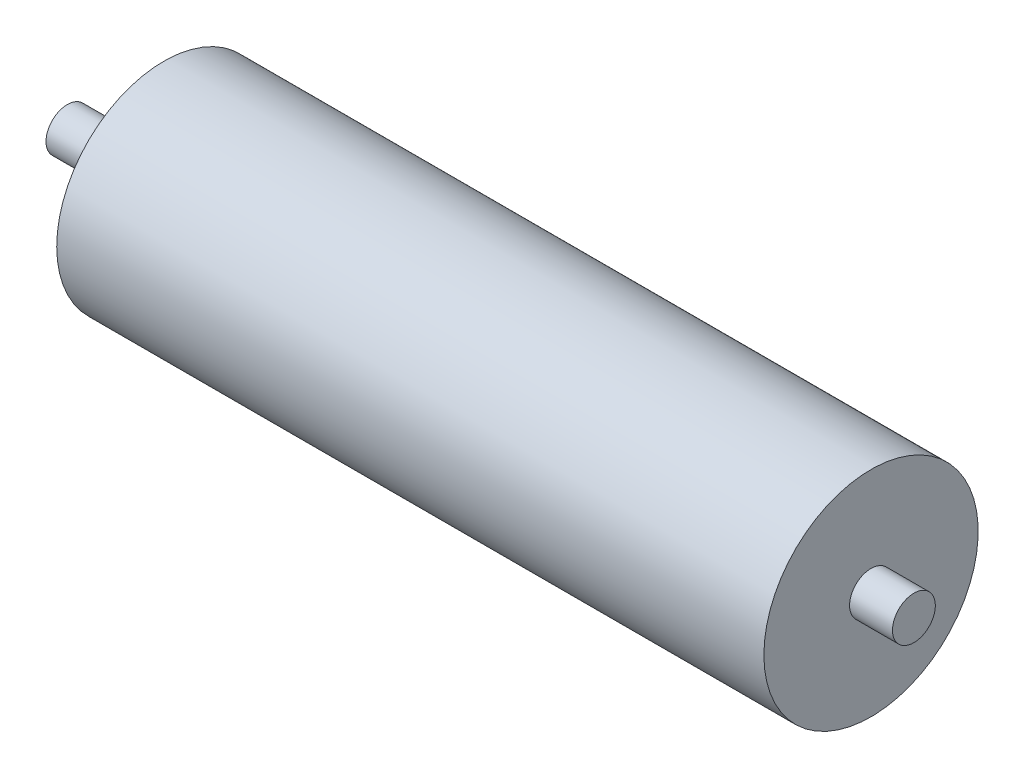
ISO-10303-21;
HEADER;
FILE_DESCRIPTION(('STEP AP214'),'2;1');
FILE_NAME('part.step','',(''),(''),'','','');
FILE_SCHEMA(('AUTOMOTIVE_DESIGN { 1 0 10303 214 1 1 1 1 }'));
ENDSEC;
DATA;
#1=APPLICATION_CONTEXT('core data for automotive mechanical design processes');
#2=APPLICATION_PROTOCOL_DEFINITION('international standard','automotive_design',2000,#1);
#3=PRODUCT_CONTEXT('',#1,'mechanical');
#4=PRODUCT('Part','Part','',(#3));
#5=PRODUCT_RELATED_PRODUCT_CATEGORY('part','',(#4));
#6=PRODUCT_DEFINITION_FORMATION('','',#4);
#7=PRODUCT_DEFINITION_CONTEXT('part definition',#1,'design');
#8=PRODUCT_DEFINITION('design','',#6,#7);
#9=PRODUCT_DEFINITION_SHAPE('','',#8);
#10=(LENGTH_UNIT() NAMED_UNIT(*) SI_UNIT(.MILLI.,.METRE.));
#11=(NAMED_UNIT(*) PLANE_ANGLE_UNIT() SI_UNIT($,.RADIAN.));
#12=(NAMED_UNIT(*) SI_UNIT($,.STERADIAN.) SOLID_ANGLE_UNIT());
#13=UNCERTAINTY_MEASURE_WITH_UNIT(LENGTH_MEASURE(1.E-05),#10,'distance_accuracy_value','');
#14=(GEOMETRIC_REPRESENTATION_CONTEXT(3) GLOBAL_UNCERTAINTY_ASSIGNED_CONTEXT((#13)) GLOBAL_UNIT_ASSIGNED_CONTEXT((#10,
#11,#12)) REPRESENTATION_CONTEXT('',''));
#15=CARTESIAN_POINT('',(0.,0.,0.));
#16=DIRECTION('',(0.,0.,1.));
#17=DIRECTION('',(1.,0.,0.));
#18=AXIS2_PLACEMENT_3D('',#15,#16,#17);
#19=CARTESIAN_POINT('',(-200.065055762082,0.,0.));
#20=DIRECTION('',(1.,0.,0.));
#21=DIRECTION('',(0.,0.,-1.));
#22=AXIS2_PLACEMENT_3D('',#19,#20,#21);
#23=PLANE('',#22);
#24=CARTESIAN_POINT('',(-200.065055762082,0.,0.));
#25=DIRECTION('',(-1.,0.,0.));
#26=DIRECTION('',(0.,0.,1.));
#27=AXIS2_PLACEMENT_3D('',#24,#25,#26);
#28=CIRCLE('',#27,10.);
#29=CARTESIAN_POINT('',(-200.065055762082,0.,10.));
#30=VERTEX_POINT('',#29);
#31=EDGE_CURVE('E10',#30,#30,#28,.T.);
#32=ORIENTED_EDGE('',*,*,#31,.T.);
#33=EDGE_LOOP('',(#32));
#34=FACE_BOUND('',#33,.T.);
#35=ADVANCED_FACE('F39',(#34),#23,.F.);
#36=CARTESIAN_POINT('',(-200.065055762082,0.,0.));
#37=DIRECTION('',(-1.,0.,0.));
#38=DIRECTION('',(0.,0.,1.));
#39=AXIS2_PLACEMENT_3D('',#36,#37,#38);
#40=CYLINDRICAL_SURFACE('',#39,10.);
#41=ORIENTED_EDGE('',*,*,#31,.F.);
#42=EDGE_LOOP('',(#41));
#43=FACE_BOUND('',#42,.T.);
#44=CARTESIAN_POINT('',(-155.065055762082,0.,0.));
#45=DIRECTION('',(-1.,0.,0.));
#46=DIRECTION('',(0.,0.,1.));
#47=AXIS2_PLACEMENT_3D('',#44,#45,#46);
#48=CIRCLE('',#47,10.);
#49=CARTESIAN_POINT('',(-155.065055762082,0.,10.));
#50=VERTEX_POINT('',#49);
#51=EDGE_CURVE('E46',#50,#50,#48,.T.);
#52=ORIENTED_EDGE('',*,*,#51,.T.);
#53=EDGE_LOOP('',(#52));
#54=FACE_BOUND('',#53,.T.);
#55=ADVANCED_FACE('F86',(#43,#54),#40,.T.);
#56=CARTESIAN_POINT('',(-155.065055762082,10.,0.));
#57=DIRECTION('',(1.,0.,0.));
#58=DIRECTION('',(0.,0.,-1.));
#59=AXIS2_PLACEMENT_3D('',#56,#57,#58);
#60=PLANE('',#59);
#61=ORIENTED_EDGE('',*,*,#51,.F.);
#62=EDGE_LOOP('',(#61));
#63=FACE_BOUND('',#62,.T.);
#64=CARTESIAN_POINT('',(-155.065055762082,0.,0.));
#65=DIRECTION('',(-1.,0.,0.));
#66=DIRECTION('',(0.,0.,1.));
#67=AXIS2_PLACEMENT_3D('',#64,#65,#66);
#68=CIRCLE('',#67,50.);
#69=CARTESIAN_POINT('',(-155.065055762082,0.,50.));
#70=VERTEX_POINT('',#69);
#71=EDGE_CURVE('E54',#70,#70,#68,.T.);
#72=ORIENTED_EDGE('',*,*,#71,.T.);
#73=EDGE_LOOP('',(#72));
#74=FACE_BOUND('',#73,.T.);
#75=ADVANCED_FACE('F90',(#63,#74),#60,.F.);
#76=CARTESIAN_POINT('',(-200.065055762082,0.,0.));
#77=DIRECTION('',(-1.,0.,0.));
#78=DIRECTION('',(0.,0.,1.));
#79=AXIS2_PLACEMENT_3D('',#76,#77,#78);
#80=CYLINDRICAL_SURFACE('',#79,50.);
#81=ORIENTED_EDGE('',*,*,#71,.F.);
#82=EDGE_LOOP('',(#81));
#83=FACE_BOUND('',#82,.T.);
#84=CARTESIAN_POINT('',(174.934944237918,0.,0.));
#85=DIRECTION('',(-1.,0.,0.));
#86=DIRECTION('',(0.,0.,1.));
#87=AXIS2_PLACEMENT_3D('',#84,#85,#86);
#88=CIRCLE('',#87,50.);
#89=CARTESIAN_POINT('',(174.934944237918,0.,50.));
#90=VERTEX_POINT('',#89);
#91=EDGE_CURVE('E60',#90,#90,#88,.T.);
#92=ORIENTED_EDGE('',*,*,#91,.T.);
#93=EDGE_LOOP('',(#92));
#94=FACE_BOUND('',#93,.T.);
#95=ADVANCED_FACE('F95',(#83,#94),#80,.T.);
#96=CARTESIAN_POINT('',(174.934944237918,50.,0.));
#97=DIRECTION('',(-1.,0.,0.));
#98=DIRECTION('',(0.,0.,1.));
#99=AXIS2_PLACEMENT_3D('',#96,#97,#98);
#100=PLANE('',#99);
#101=ORIENTED_EDGE('',*,*,#91,.F.);
#102=EDGE_LOOP('',(#101));
#103=FACE_BOUND('',#102,.T.);
#104=CARTESIAN_POINT('',(174.934944237918,0.,0.));
#105=DIRECTION('',(-1.,0.,0.));
#106=DIRECTION('',(0.,0.,1.));
#107=AXIS2_PLACEMENT_3D('',#104,#105,#106);
#108=CIRCLE('',#107,10.);
#109=CARTESIAN_POINT('',(174.934944237918,0.,10.));
#110=VERTEX_POINT('',#109);
#111=EDGE_CURVE('E65',#110,#110,#108,.T.);
#112=ORIENTED_EDGE('',*,*,#111,.T.);
#113=EDGE_LOOP('',(#112));
#114=FACE_BOUND('',#113,.T.);
#115=ADVANCED_FACE('F82',(#103,#114),#100,.F.);
#116=CARTESIAN_POINT('',(-200.065055762082,0.,0.));
#117=DIRECTION('',(-1.,0.,0.));
#118=DIRECTION('',(0.,0.,1.));
#119=AXIS2_PLACEMENT_3D('',#116,#117,#118);
#120=CYLINDRICAL_SURFACE('',#119,10.);
#121=ORIENTED_EDGE('',*,*,#111,.F.);
#122=EDGE_LOOP('',(#121));
#123=FACE_BOUND('',#122,.T.);
#124=CARTESIAN_POINT('',(194.934944237918,0.,0.));
#125=DIRECTION('',(-1.,0.,0.));
#126=DIRECTION('',(0.,0.,1.));
#127=AXIS2_PLACEMENT_3D('',#124,#125,#126);
#128=CIRCLE('',#127,10.);
#129=CARTESIAN_POINT('',(194.934944237918,0.,10.));
#130=VERTEX_POINT('',#129);
#131=EDGE_CURVE('E69',#130,#130,#128,.T.);
#132=ORIENTED_EDGE('',*,*,#131,.T.);
#133=EDGE_LOOP('',(#132));
#134=FACE_BOUND('',#133,.T.);
#135=ADVANCED_FACE('F74',(#123,#134),#120,.T.);
#136=CARTESIAN_POINT('',(194.934944237918,10.,0.));
#137=DIRECTION('',(-1.,0.,0.));
#138=DIRECTION('',(0.,0.,1.));
#139=AXIS2_PLACEMENT_3D('',#136,#137,#138);
#140=PLANE('',#139);
#141=ORIENTED_EDGE('',*,*,#131,.F.);
#142=EDGE_LOOP('',(#141));
#143=FACE_BOUND('',#142,.T.);
#144=ADVANCED_FACE('F76',(#143),#140,.F.);
#145=CLOSED_SHELL('',(#35,#55,#75,#95,#115,#135,#144));
#146=MANIFOLD_SOLID_BREP('B2',#145);
#147=ADVANCED_BREP_SHAPE_REPRESENTATION('',(#18,#146),#14);
#148=SHAPE_DEFINITION_REPRESENTATION(#9,#147);
ENDSEC;
END-ISO-10303-21;
